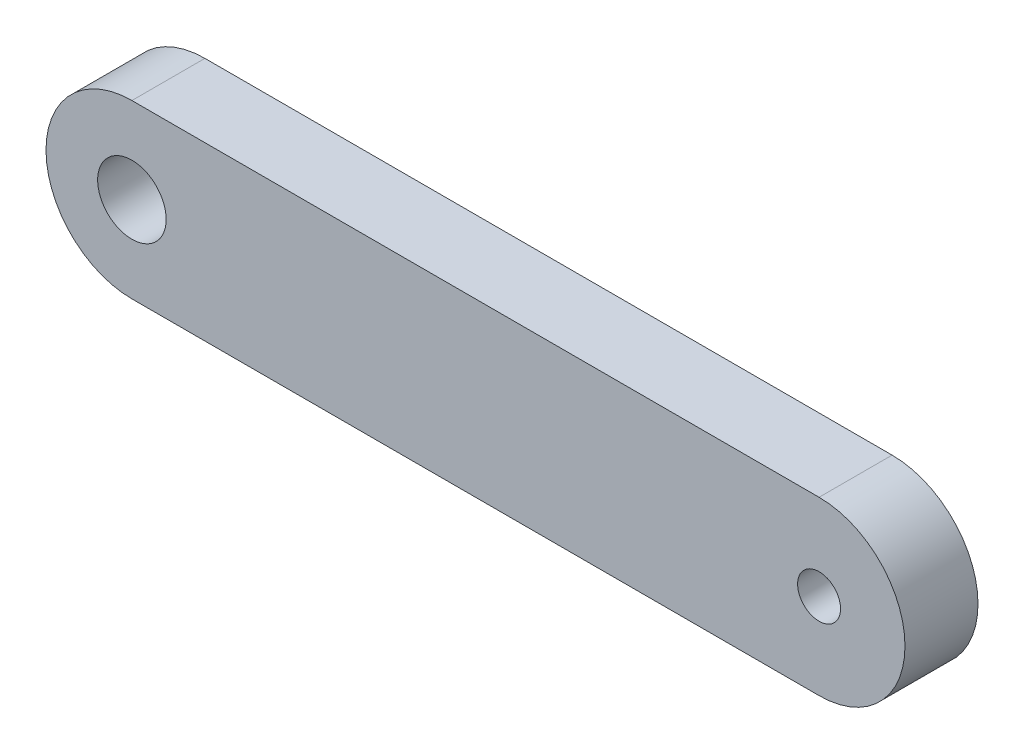
ISO-10303-21;
HEADER;
FILE_DESCRIPTION(('STEP AP214'),'2;1');
FILE_NAME('part.step','',(''),(''),'','','');
FILE_SCHEMA(('AUTOMOTIVE_DESIGN { 1 0 10303 214 1 1 1 1 }'));
ENDSEC;
DATA;
#1=APPLICATION_CONTEXT('core data for automotive mechanical design processes');
#2=APPLICATION_PROTOCOL_DEFINITION('international standard','automotive_design',2000,#1);
#3=PRODUCT_CONTEXT('',#1,'mechanical');
#4=PRODUCT('Part','Part','',(#3));
#5=PRODUCT_RELATED_PRODUCT_CATEGORY('part','',(#4));
#6=PRODUCT_DEFINITION_FORMATION('','',#4);
#7=PRODUCT_DEFINITION_CONTEXT('part definition',#1,'design');
#8=PRODUCT_DEFINITION('design','',#6,#7);
#9=PRODUCT_DEFINITION_SHAPE('','',#8);
#10=(LENGTH_UNIT() NAMED_UNIT(*) SI_UNIT(.MILLI.,.METRE.));
#11=(NAMED_UNIT(*) PLANE_ANGLE_UNIT() SI_UNIT($,.RADIAN.));
#12=(NAMED_UNIT(*) SI_UNIT($,.STERADIAN.) SOLID_ANGLE_UNIT());
#13=UNCERTAINTY_MEASURE_WITH_UNIT(LENGTH_MEASURE(1.E-05),#10,'distance_accuracy_value','');
#14=(GEOMETRIC_REPRESENTATION_CONTEXT(3) GLOBAL_UNCERTAINTY_ASSIGNED_CONTEXT((#13)) GLOBAL_UNIT_ASSIGNED_CONTEXT((#10,
#11,#12)) REPRESENTATION_CONTEXT('',''));
#15=CARTESIAN_POINT('',(0.,0.,0.));
#16=DIRECTION('',(0.,0.,1.));
#17=DIRECTION('',(1.,0.,0.));
#18=AXIS2_PLACEMENT_3D('',#15,#16,#17);
#19=CARTESIAN_POINT('',(0.,0.,8.5));
#20=DIRECTION('',(0.,0.,1.));
#21=DIRECTION('',(1.,0.,0.));
#22=AXIS2_PLACEMENT_3D('',#19,#20,#21);
#23=PLANE('',#22);
#24=CARTESIAN_POINT('',(0.,0.,8.5));
#25=DIRECTION('',(0.,0.,1.));
#26=DIRECTION('',(1.,0.,0.));
#27=AXIS2_PLACEMENT_3D('',#24,#25,#26);
#28=CIRCLE('',#27,3.98703101993388);
#29=CARTESIAN_POINT('',(3.98703101993388,0.,8.5));
#30=VERTEX_POINT('',#29);
#31=EDGE_CURVE('E147',#30,#30,#28,.T.);
#32=ORIENTED_EDGE('',*,*,#31,.F.);
#33=EDGE_LOOP('',(#32));
#34=FACE_BOUND('',#33,.T.);
#35=CARTESIAN_POINT('',(0.,0.,8.5));
#36=DIRECTION('',(0.,0.,1.));
#37=DIRECTION('',(1.,0.,0.));
#38=AXIS2_PLACEMENT_3D('',#35,#36,#37);
#39=CIRCLE('',#38,10.);
#40=CARTESIAN_POINT('',(0.,10.,8.5));
#41=VERTEX_POINT('',#40);
#42=CARTESIAN_POINT('',(0.,-10.,8.5));
#43=VERTEX_POINT('',#42);
#44=EDGE_CURVE('E102',#41,#43,#39,.T.);
#45=ORIENTED_EDGE('',*,*,#44,.T.);
#46=DIRECTION('',(1.,0.,0.));
#47=VECTOR('',#46,1.);
#48=CARTESIAN_POINT('',(0.,-10.,8.5));
#49=LINE('',#48,#47);
#50=CARTESIAN_POINT('',(80.,-9.99999999999999,8.5));
#51=VERTEX_POINT('',#50);
#52=EDGE_CURVE('E97',#43,#51,#49,.T.);
#53=ORIENTED_EDGE('',*,*,#52,.T.);
#54=CARTESIAN_POINT('',(80.,0.,8.5));
#55=DIRECTION('',(0.,0.,1.));
#56=DIRECTION('',(1.,0.,0.));
#57=AXIS2_PLACEMENT_3D('',#54,#55,#56);
#58=CIRCLE('',#57,10.);
#59=CARTESIAN_POINT('',(80.,10.,8.5));
#60=VERTEX_POINT('',#59);
#61=EDGE_CURVE('E100',#51,#60,#58,.T.);
#62=ORIENTED_EDGE('',*,*,#61,.T.);
#63=DIRECTION('',(-1.,0.,0.));
#64=VECTOR('',#63,1.);
#65=CARTESIAN_POINT('',(0.,10.,8.5));
#66=LINE('',#65,#64);
#67=EDGE_CURVE('E67',#60,#41,#66,.T.);
#68=ORIENTED_EDGE('',*,*,#67,.T.);
#69=EDGE_LOOP('',(#45,#53,#62,#68));
#70=FACE_BOUND('',#69,.T.);
#71=CARTESIAN_POINT('',(80.,0.,8.5));
#72=DIRECTION('',(0.,0.,1.));
#73=DIRECTION('',(-1.,0.,0.));
#74=AXIS2_PLACEMENT_3D('',#71,#72,#73);
#75=CIRCLE('',#74,2.49999999999999);
#76=CARTESIAN_POINT('',(77.5,0.,8.5));
#77=VERTEX_POINT('',#76);
#78=EDGE_CURVE('E123',#77,#77,#75,.T.);
#79=ORIENTED_EDGE('',*,*,#78,.F.);
#80=EDGE_LOOP('',(#79));
#81=FACE_BOUND('',#80,.T.);
#82=ADVANCED_FACE('F49',(#34,#70,#81),#23,.T.);
#83=CARTESIAN_POINT('',(0.,0.,0.));
#84=DIRECTION('',(0.,0.,1.));
#85=DIRECTION('',(1.,0.,0.));
#86=AXIS2_PLACEMENT_3D('',#83,#84,#85);
#87=PLANE('',#86);
#88=CARTESIAN_POINT('',(0.,0.,0.));
#89=DIRECTION('',(0.,0.,1.));
#90=DIRECTION('',(1.,0.,0.));
#91=AXIS2_PLACEMENT_3D('',#88,#89,#90);
#92=CIRCLE('',#91,3.98703101993388);
#93=CARTESIAN_POINT('',(3.98703101993388,0.,0.));
#94=VERTEX_POINT('',#93);
#95=EDGE_CURVE('E154',#94,#94,#92,.T.);
#96=ORIENTED_EDGE('',*,*,#95,.T.);
#97=EDGE_LOOP('',(#96));
#98=FACE_BOUND('',#97,.T.);
#99=CARTESIAN_POINT('',(0.,0.,0.));
#100=DIRECTION('',(0.,0.,1.));
#101=DIRECTION('',(1.,0.,0.));
#102=AXIS2_PLACEMENT_3D('',#99,#100,#101);
#103=CIRCLE('',#102,10.);
#104=CARTESIAN_POINT('',(0.,10.,0.));
#105=VERTEX_POINT('',#104);
#106=CARTESIAN_POINT('',(0.,-10.,0.));
#107=VERTEX_POINT('',#106);
#108=EDGE_CURVE('E120',#105,#107,#103,.T.);
#109=ORIENTED_EDGE('',*,*,#108,.F.);
#110=DIRECTION('',(-1.,0.,0.));
#111=VECTOR('',#110,1.);
#112=CARTESIAN_POINT('',(0.,10.,0.));
#113=LINE('',#112,#111);
#114=CARTESIAN_POINT('',(80.,10.,0.));
#115=VERTEX_POINT('',#114);
#116=EDGE_CURVE('E90',#115,#105,#113,.T.);
#117=ORIENTED_EDGE('',*,*,#116,.F.);
#118=CARTESIAN_POINT('',(80.,0.,0.));
#119=DIRECTION('',(0.,0.,1.));
#120=DIRECTION('',(1.,0.,0.));
#121=AXIS2_PLACEMENT_3D('',#118,#119,#120);
#122=CIRCLE('',#121,10.);
#123=CARTESIAN_POINT('',(80.,-9.99999999999999,0.));
#124=VERTEX_POINT('',#123);
#125=EDGE_CURVE('E84',#124,#115,#122,.T.);
#126=ORIENTED_EDGE('',*,*,#125,.F.);
#127=DIRECTION('',(1.,0.,0.));
#128=VECTOR('',#127,1.);
#129=CARTESIAN_POINT('',(0.,-10.,0.));
#130=LINE('',#129,#128);
#131=EDGE_CURVE('E107',#107,#124,#130,.T.);
#132=ORIENTED_EDGE('',*,*,#131,.F.);
#133=EDGE_LOOP('',(#109,#117,#126,#132));
#134=FACE_BOUND('',#133,.T.);
#135=CARTESIAN_POINT('',(80.,0.,0.));
#136=DIRECTION('',(0.,0.,1.));
#137=DIRECTION('',(-1.,0.,0.));
#138=AXIS2_PLACEMENT_3D('',#135,#136,#137);
#139=CIRCLE('',#138,2.49999999999999);
#140=CARTESIAN_POINT('',(77.5,0.,0.));
#141=VERTEX_POINT('',#140);
#142=EDGE_CURVE('E143',#141,#141,#139,.T.);
#143=ORIENTED_EDGE('',*,*,#142,.T.);
#144=EDGE_LOOP('',(#143));
#145=FACE_BOUND('',#144,.T.);
#146=ADVANCED_FACE('F137',(#98,#134,#145),#87,.F.);
#147=CARTESIAN_POINT('',(0.,0.,8.5));
#148=DIRECTION('',(0.,0.,-1.));
#149=DIRECTION('',(-1.,0.,0.));
#150=AXIS2_PLACEMENT_3D('',#147,#148,#149);
#151=CYLINDRICAL_SURFACE('',#150,10.);
#152=ORIENTED_EDGE('',*,*,#108,.T.);
#153=DIRECTION('',(0.,0.,-1.));
#154=VECTOR('',#153,1.);
#155=CARTESIAN_POINT('',(0.,-10.,8.5));
#156=LINE('',#155,#154);
#157=EDGE_CURVE('E11',#43,#107,#156,.T.);
#158=ORIENTED_EDGE('',*,*,#157,.F.);
#159=ORIENTED_EDGE('',*,*,#44,.F.);
#160=DIRECTION('',(0.,0.,-1.));
#161=VECTOR('',#160,1.);
#162=CARTESIAN_POINT('',(0.,10.,8.5));
#163=LINE('',#162,#161);
#164=EDGE_CURVE('E116',#41,#105,#163,.T.);
#165=ORIENTED_EDGE('',*,*,#164,.T.);
#166=EDGE_LOOP('',(#152,#158,#159,#165));
#167=FACE_BOUND('',#166,.T.);
#168=ADVANCED_FACE('F51',(#167),#151,.T.);
#169=CARTESIAN_POINT('',(0.,-10.,8.5));
#170=DIRECTION('',(0.,1.,0.));
#171=DIRECTION('',(-1.,0.,0.));
#172=AXIS2_PLACEMENT_3D('',#169,#170,#171);
#173=PLANE('',#172);
#174=ORIENTED_EDGE('',*,*,#131,.T.);
#175=DIRECTION('',(0.,0.,-1.));
#176=VECTOR('',#175,1.);
#177=CARTESIAN_POINT('',(80.,-9.99999999999999,8.5));
#178=LINE('',#177,#176);
#179=EDGE_CURVE('E59',#51,#124,#178,.T.);
#180=ORIENTED_EDGE('',*,*,#179,.F.);
#181=ORIENTED_EDGE('',*,*,#52,.F.);
#182=ORIENTED_EDGE('',*,*,#157,.T.);
#183=EDGE_LOOP('',(#174,#180,#181,#182));
#184=FACE_BOUND('',#183,.T.);
#185=ADVANCED_FACE('F106',(#184),#173,.F.);
#186=CARTESIAN_POINT('',(80.,0.,8.5));
#187=DIRECTION('',(0.,0.,-1.));
#188=DIRECTION('',(-1.,0.,0.));
#189=AXIS2_PLACEMENT_3D('',#186,#187,#188);
#190=CYLINDRICAL_SURFACE('',#189,10.);
#191=ORIENTED_EDGE('',*,*,#125,.T.);
#192=DIRECTION('',(0.,0.,-1.));
#193=VECTOR('',#192,1.);
#194=CARTESIAN_POINT('',(80.,10.,8.5));
#195=LINE('',#194,#193);
#196=EDGE_CURVE('E109',#60,#115,#195,.T.);
#197=ORIENTED_EDGE('',*,*,#196,.F.);
#198=ORIENTED_EDGE('',*,*,#61,.F.);
#199=ORIENTED_EDGE('',*,*,#179,.T.);
#200=EDGE_LOOP('',(#191,#197,#198,#199));
#201=FACE_BOUND('',#200,.T.);
#202=ADVANCED_FACE('F110',(#201),#190,.T.);
#203=CARTESIAN_POINT('',(0.,10.,8.5));
#204=DIRECTION('',(0.,-1.,0.));
#205=DIRECTION('',(1.,0.,0.));
#206=AXIS2_PLACEMENT_3D('',#203,#204,#205);
#207=PLANE('',#206);
#208=ORIENTED_EDGE('',*,*,#116,.T.);
#209=ORIENTED_EDGE('',*,*,#164,.F.);
#210=ORIENTED_EDGE('',*,*,#67,.F.);
#211=ORIENTED_EDGE('',*,*,#196,.T.);
#212=EDGE_LOOP('',(#208,#209,#210,#211));
#213=FACE_BOUND('',#212,.T.);
#214=ADVANCED_FACE('F134',(#213),#207,.F.);
#215=CARTESIAN_POINT('',(80.,0.,8.5));
#216=DIRECTION('',(0.,0.,-1.));
#217=DIRECTION('',(-1.,0.,0.));
#218=AXIS2_PLACEMENT_3D('',#215,#216,#217);
#219=CYLINDRICAL_SURFACE('',#218,2.49999999999999);
#220=ORIENTED_EDGE('',*,*,#78,.T.);
#221=EDGE_LOOP('',(#220));
#222=FACE_BOUND('',#221,.T.);
#223=ORIENTED_EDGE('',*,*,#142,.F.);
#224=EDGE_LOOP('',(#223));
#225=FACE_BOUND('',#224,.T.);
#226=ADVANCED_FACE('F163',(#222,#225),#219,.F.);
#227=CARTESIAN_POINT('',(0.,0.,0.));
#228=DIRECTION('',(0.,0.,1.));
#229=DIRECTION('',(1.,0.,0.));
#230=AXIS2_PLACEMENT_3D('',#227,#228,#229);
#231=CYLINDRICAL_SURFACE('',#230,3.98703101993388);
#232=ORIENTED_EDGE('',*,*,#31,.T.);
#233=EDGE_LOOP('',(#232));
#234=FACE_BOUND('',#233,.T.);
#235=ORIENTED_EDGE('',*,*,#95,.F.);
#236=EDGE_LOOP('',(#235));
#237=FACE_BOUND('',#236,.T.);
#238=ADVANCED_FACE('F161',(#234,#237),#231,.F.);
#239=CLOSED_SHELL('',(#82,#146,#168,#185,#202,#214,#226,#238));
#240=MANIFOLD_SOLID_BREP('B2',#239);
#241=ADVANCED_BREP_SHAPE_REPRESENTATION('',(#18,#240),#14);
#242=SHAPE_DEFINITION_REPRESENTATION(#9,#241);
ENDSEC;
END-ISO-10303-21;
